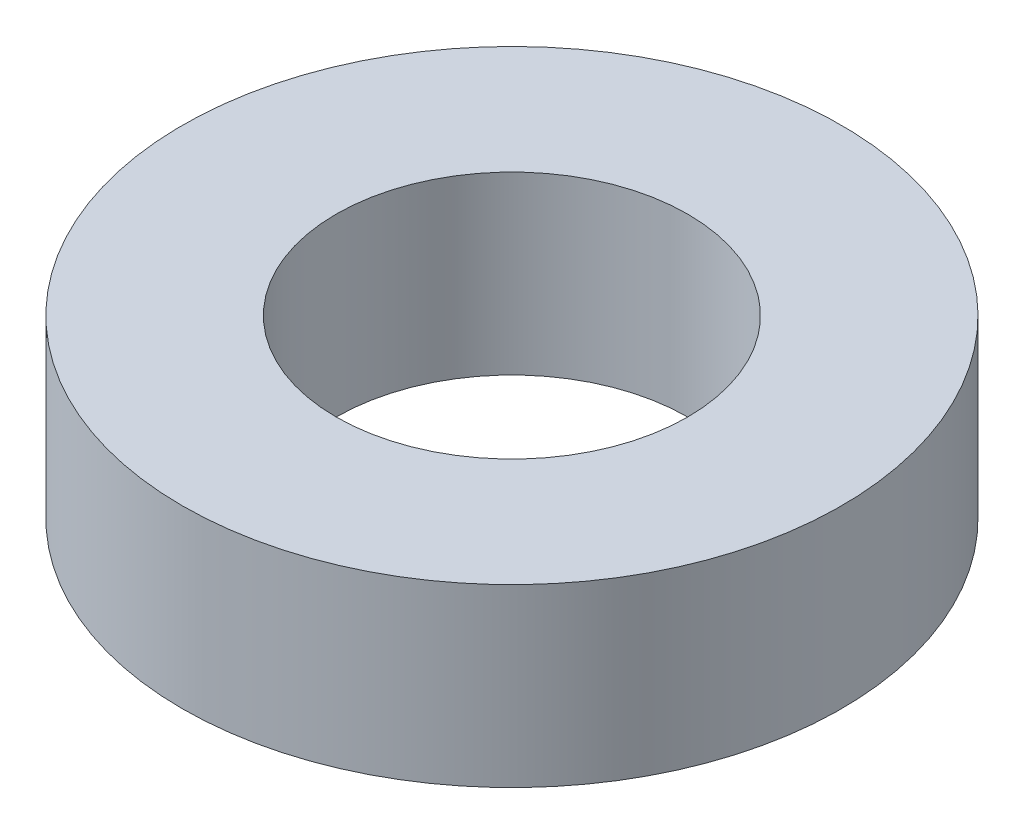
ISO-10303-21;
HEADER;
FILE_DESCRIPTION(('STEP AP214'),'2;1');
FILE_NAME('part.step','',(''),(''),'','','');
FILE_SCHEMA(('AUTOMOTIVE_DESIGN { 1 0 10303 214 1 1 1 1 }'));
ENDSEC;
DATA;
#1=APPLICATION_CONTEXT('core data for automotive mechanical design processes');
#2=APPLICATION_PROTOCOL_DEFINITION('international standard','automotive_design',2000,#1);
#3=PRODUCT_CONTEXT('',#1,'mechanical');
#4=PRODUCT('Part','Part','',(#3));
#5=PRODUCT_RELATED_PRODUCT_CATEGORY('part','',(#4));
#6=PRODUCT_DEFINITION_FORMATION('','',#4);
#7=PRODUCT_DEFINITION_CONTEXT('part definition',#1,'design');
#8=PRODUCT_DEFINITION('design','',#6,#7);
#9=PRODUCT_DEFINITION_SHAPE('','',#8);
#10=(LENGTH_UNIT() NAMED_UNIT(*) SI_UNIT(.MILLI.,.METRE.));
#11=(NAMED_UNIT(*) PLANE_ANGLE_UNIT() SI_UNIT($,.RADIAN.));
#12=(NAMED_UNIT(*) SI_UNIT($,.STERADIAN.) SOLID_ANGLE_UNIT());
#13=UNCERTAINTY_MEASURE_WITH_UNIT(LENGTH_MEASURE(1.E-05),#10,'distance_accuracy_value','');
#14=(GEOMETRIC_REPRESENTATION_CONTEXT(3) GLOBAL_UNCERTAINTY_ASSIGNED_CONTEXT((#13)) GLOBAL_UNIT_ASSIGNED_CONTEXT((#10,
#11,#12)) REPRESENTATION_CONTEXT('',''));
#15=CARTESIAN_POINT('',(0.,0.,0.));
#16=DIRECTION('',(0.,0.,1.));
#17=DIRECTION('',(1.,0.,0.));
#18=AXIS2_PLACEMENT_3D('',#15,#16,#17);
#19=CARTESIAN_POINT('',(0.,6.35,0.));
#20=DIRECTION('',(0.,1.,0.));
#21=DIRECTION('',(0.,0.,1.));
#22=AXIS2_PLACEMENT_3D('',#19,#20,#21);
#23=PLANE('',#22);
#24=CARTESIAN_POINT('',(0.,6.35,0.));
#25=DIRECTION('',(0.,1.,0.));
#26=DIRECTION('',(0.,0.,1.));
#27=AXIS2_PLACEMENT_3D('',#24,#25,#26);
#28=CIRCLE('',#27,11.90625);
#29=CARTESIAN_POINT('',(0.,6.35,11.90625));
#30=VERTEX_POINT('',#29);
#31=EDGE_CURVE('E10',#30,#30,#28,.T.);
#32=ORIENTED_EDGE('',*,*,#31,.T.);
#33=EDGE_LOOP('',(#32));
#34=FACE_BOUND('',#33,.T.);
#35=CARTESIAN_POINT('',(0.,6.35,0.));
#36=DIRECTION('',(0.,1.,0.));
#37=DIRECTION('',(0.,0.,1.));
#38=AXIS2_PLACEMENT_3D('',#35,#36,#37);
#39=CIRCLE('',#38,6.35);
#40=CARTESIAN_POINT('',(0.,6.35,6.35));
#41=VERTEX_POINT('',#40);
#42=EDGE_CURVE('E43',#41,#41,#39,.T.);
#43=ORIENTED_EDGE('',*,*,#42,.F.);
#44=EDGE_LOOP('',(#43));
#45=FACE_BOUND('',#44,.T.);
#46=ADVANCED_FACE('F32',(#34,#45),#23,.T.);
#47=CARTESIAN_POINT('',(0.,0.,0.));
#48=DIRECTION('',(0.,1.,0.));
#49=DIRECTION('',(0.,0.,1.));
#50=AXIS2_PLACEMENT_3D('',#47,#48,#49);
#51=PLANE('',#50);
#52=CARTESIAN_POINT('',(0.,0.,0.));
#53=DIRECTION('',(0.,1.,0.));
#54=DIRECTION('',(0.,0.,1.));
#55=AXIS2_PLACEMENT_3D('',#52,#53,#54);
#56=CIRCLE('',#55,11.90625);
#57=CARTESIAN_POINT('',(0.,0.,11.90625));
#58=VERTEX_POINT('',#57);
#59=EDGE_CURVE('E36',#58,#58,#56,.T.);
#60=ORIENTED_EDGE('',*,*,#59,.F.);
#61=EDGE_LOOP('',(#60));
#62=FACE_BOUND('',#61,.T.);
#63=CARTESIAN_POINT('',(0.,0.,0.));
#64=DIRECTION('',(0.,1.,0.));
#65=DIRECTION('',(0.,0.,1.));
#66=AXIS2_PLACEMENT_3D('',#63,#64,#65);
#67=CIRCLE('',#66,6.35);
#68=CARTESIAN_POINT('',(0.,0.,6.35));
#69=VERTEX_POINT('',#68);
#70=EDGE_CURVE('E45',#69,#69,#67,.T.);
#71=ORIENTED_EDGE('',*,*,#70,.T.);
#72=EDGE_LOOP('',(#71));
#73=FACE_BOUND('',#72,.T.);
#74=ADVANCED_FACE('F55',(#62,#73),#51,.F.);
#75=CARTESIAN_POINT('',(0.,6.35,0.));
#76=DIRECTION('',(0.,-1.,0.));
#77=DIRECTION('',(0.,0.,-1.));
#78=AXIS2_PLACEMENT_3D('',#75,#76,#77);
#79=CYLINDRICAL_SURFACE('',#78,11.90625);
#80=ORIENTED_EDGE('',*,*,#31,.F.);
#81=EDGE_LOOP('',(#80));
#82=FACE_BOUND('',#81,.T.);
#83=ORIENTED_EDGE('',*,*,#59,.T.);
#84=EDGE_LOOP('',(#83));
#85=FACE_BOUND('',#84,.T.);
#86=ADVANCED_FACE('F34',(#82,#85),#79,.T.);
#87=CARTESIAN_POINT('',(0.,6.35,0.));
#88=DIRECTION('',(0.,-1.,0.));
#89=DIRECTION('',(0.,0.,-1.));
#90=AXIS2_PLACEMENT_3D('',#87,#88,#89);
#91=CYLINDRICAL_SURFACE('',#90,6.35);
#92=ORIENTED_EDGE('',*,*,#42,.T.);
#93=EDGE_LOOP('',(#92));
#94=FACE_BOUND('',#93,.T.);
#95=ORIENTED_EDGE('',*,*,#70,.F.);
#96=EDGE_LOOP('',(#95));
#97=FACE_BOUND('',#96,.T.);
#98=ADVANCED_FACE('F51',(#94,#97),#91,.F.);
#99=CLOSED_SHELL('',(#46,#74,#86,#98));
#100=MANIFOLD_SOLID_BREP('B2',#99);
#101=ADVANCED_BREP_SHAPE_REPRESENTATION('',(#18,#100),#14);
#102=SHAPE_DEFINITION_REPRESENTATION(#9,#101);
ENDSEC;
END-ISO-10303-21;
